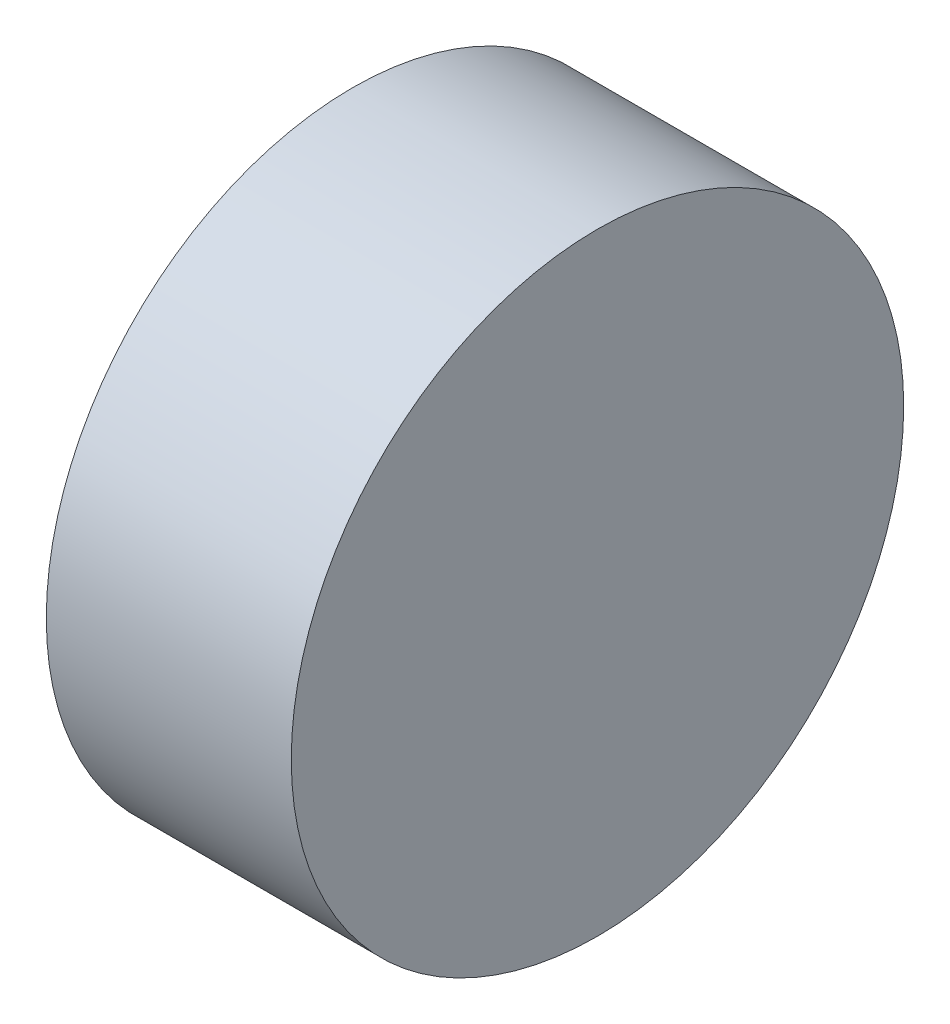
ISO-10303-21;
HEADER;
FILE_DESCRIPTION(('STEP AP214'),'2;1');
FILE_NAME('part.step','',(''),(''),'','','');
FILE_SCHEMA(('AUTOMOTIVE_DESIGN { 1 0 10303 214 1 1 1 1 }'));
ENDSEC;
DATA;
#1=APPLICATION_CONTEXT('core data for automotive mechanical design processes');
#2=APPLICATION_PROTOCOL_DEFINITION('international standard','automotive_design',2000,#1);
#3=PRODUCT_CONTEXT('',#1,'mechanical');
#4=PRODUCT('Part','Part','',(#3));
#5=PRODUCT_RELATED_PRODUCT_CATEGORY('part','',(#4));
#6=PRODUCT_DEFINITION_FORMATION('','',#4);
#7=PRODUCT_DEFINITION_CONTEXT('part definition',#1,'design');
#8=PRODUCT_DEFINITION('design','',#6,#7);
#9=PRODUCT_DEFINITION_SHAPE('','',#8);
#10=(LENGTH_UNIT() NAMED_UNIT(*) SI_UNIT(.MILLI.,.METRE.));
#11=(NAMED_UNIT(*) PLANE_ANGLE_UNIT() SI_UNIT($,.RADIAN.));
#12=(NAMED_UNIT(*) SI_UNIT($,.STERADIAN.) SOLID_ANGLE_UNIT());
#13=UNCERTAINTY_MEASURE_WITH_UNIT(LENGTH_MEASURE(1.E-05),#10,'distance_accuracy_value','');
#14=(GEOMETRIC_REPRESENTATION_CONTEXT(3) GLOBAL_UNCERTAINTY_ASSIGNED_CONTEXT((#13)) GLOBAL_UNIT_ASSIGNED_CONTEXT((#10,
#11,#12)) REPRESENTATION_CONTEXT('',''));
#15=CARTESIAN_POINT('',(0.,0.,0.));
#16=DIRECTION('',(0.,0.,1.));
#17=DIRECTION('',(1.,0.,0.));
#18=AXIS2_PLACEMENT_3D('',#15,#16,#17);
#19=CARTESIAN_POINT('',(4.,0.,0.));
#20=DIRECTION('',(-1.,0.,0.));
#21=DIRECTION('',(0.,0.,1.));
#22=AXIS2_PLACEMENT_3D('',#19,#20,#21);
#23=CYLINDRICAL_SURFACE('',#22,10.);
#24=CARTESIAN_POINT('',(4.,0.,0.));
#25=DIRECTION('',(1.,0.,0.));
#26=DIRECTION('',(0.,0.,-1.));
#27=AXIS2_PLACEMENT_3D('',#24,#25,#26);
#28=CIRCLE('',#27,10.);
#29=CARTESIAN_POINT('',(4.,0.,-10.));
#30=VERTEX_POINT('',#29);
#31=EDGE_CURVE('E11',#30,#30,#28,.T.);
#32=ORIENTED_EDGE('',*,*,#31,.F.);
#33=EDGE_LOOP('',(#32));
#34=FACE_BOUND('',#33,.T.);
#35=CARTESIAN_POINT('',(-4.,0.,0.));
#36=DIRECTION('',(1.,0.,0.));
#37=DIRECTION('',(0.,0.,-1.));
#38=AXIS2_PLACEMENT_3D('',#35,#36,#37);
#39=CIRCLE('',#38,10.);
#40=CARTESIAN_POINT('',(-4.,0.,-10.));
#41=VERTEX_POINT('',#40);
#42=EDGE_CURVE('E46',#41,#41,#39,.T.);
#43=ORIENTED_EDGE('',*,*,#42,.T.);
#44=EDGE_LOOP('',(#43));
#45=FACE_BOUND('',#44,.T.);
#46=ADVANCED_FACE('F43',(#34,#45),#23,.T.);
#47=CARTESIAN_POINT('',(4.,0.,0.));
#48=DIRECTION('',(1.,0.,0.));
#49=DIRECTION('',(0.,0.,-1.));
#50=AXIS2_PLACEMENT_3D('',#47,#48,#49);
#51=PLANE('',#50);
#52=ORIENTED_EDGE('',*,*,#31,.T.);
#53=EDGE_LOOP('',(#52));
#54=FACE_BOUND('',#53,.T.);
#55=ADVANCED_FACE('F107',(#54),#51,.T.);
#56=CARTESIAN_POINT('',(-4.,0.,0.));
#57=DIRECTION('',(1.,0.,0.));
#58=DIRECTION('',(0.,0.,-1.));
#59=AXIS2_PLACEMENT_3D('',#56,#57,#58);
#60=PLANE('',#59);
#61=CARTESIAN_POINT('',(-4.,0.,0.));
#62=DIRECTION('',(-1.,0.,0.));
#63=DIRECTION('',(0.,0.,1.));
#64=AXIS2_PLACEMENT_3D('',#61,#62,#63);
#65=CIRCLE('',#64,6.5);
#66=CARTESIAN_POINT('',(-4.,0.,6.5));
#67=VERTEX_POINT('',#66);
#68=EDGE_CURVE('E57',#67,#67,#65,.T.);
#69=ORIENTED_EDGE('',*,*,#68,.F.);
#70=EDGE_LOOP('',(#69));
#71=FACE_BOUND('',#70,.T.);
#72=ORIENTED_EDGE('',*,*,#42,.F.);
#73=EDGE_LOOP('',(#72));
#74=FACE_BOUND('',#73,.T.);
#75=ADVANCED_FACE('F93',(#71,#74),#60,.F.);
#76=CARTESIAN_POINT('',(2.,0.,0.));
#77=DIRECTION('',(-1.,0.,0.));
#78=DIRECTION('',(0.,0.,1.));
#79=AXIS2_PLACEMENT_3D('',#76,#77,#78);
#80=CYLINDRICAL_SURFACE('',#79,2.);
#81=CARTESIAN_POINT('',(2.,0.,0.));
#82=DIRECTION('',(-1.,0.,0.));
#83=DIRECTION('',(0.,0.,1.));
#84=AXIS2_PLACEMENT_3D('',#81,#82,#83);
#85=CIRCLE('',#84,2.);
#86=CARTESIAN_POINT('',(2.,0.,2.));
#87=VERTEX_POINT('',#86);
#88=EDGE_CURVE('E61',#87,#87,#85,.T.);
#89=ORIENTED_EDGE('',*,*,#88,.T.);
#90=EDGE_LOOP('',(#89));
#91=FACE_BOUND('',#90,.T.);
#92=CARTESIAN_POINT('',(-4.,0.,0.));
#93=DIRECTION('',(-1.,0.,0.));
#94=DIRECTION('',(0.,0.,1.));
#95=AXIS2_PLACEMENT_3D('',#92,#93,#94);
#96=CIRCLE('',#95,2.);
#97=CARTESIAN_POINT('',(-4.,0.,2.));
#98=VERTEX_POINT('',#97);
#99=EDGE_CURVE('E62',#98,#98,#96,.T.);
#100=ORIENTED_EDGE('',*,*,#99,.F.);
#101=EDGE_LOOP('',(#100));
#102=FACE_BOUND('',#101,.T.);
#103=ADVANCED_FACE('F96',(#91,#102),#80,.T.);
#104=CARTESIAN_POINT('',(2.,0.,0.));
#105=DIRECTION('',(-1.,0.,0.));
#106=DIRECTION('',(0.,0.,1.));
#107=AXIS2_PLACEMENT_3D('',#104,#105,#106);
#108=CYLINDRICAL_SURFACE('',#107,6.5);
#109=CARTESIAN_POINT('',(2.,0.,0.));
#110=DIRECTION('',(-1.,0.,0.));
#111=DIRECTION('',(0.,0.,1.));
#112=AXIS2_PLACEMENT_3D('',#109,#110,#111);
#113=CIRCLE('',#112,6.5);
#114=CARTESIAN_POINT('',(2.,0.,6.5));
#115=VERTEX_POINT('',#114);
#116=EDGE_CURVE('E55',#115,#115,#113,.T.);
#117=ORIENTED_EDGE('',*,*,#116,.F.);
#118=EDGE_LOOP('',(#117));
#119=FACE_BOUND('',#118,.T.);
#120=ORIENTED_EDGE('',*,*,#68,.T.);
#121=EDGE_LOOP('',(#120));
#122=FACE_BOUND('',#121,.T.);
#123=ADVANCED_FACE('F98',(#119,#122),#108,.F.);
#124=CARTESIAN_POINT('',(2.,0.,0.));
#125=DIRECTION('',(-1.,0.,0.));
#126=DIRECTION('',(0.,0.,1.));
#127=AXIS2_PLACEMENT_3D('',#124,#125,#126);
#128=PLANE('',#127);
#129=ORIENTED_EDGE('',*,*,#88,.F.);
#130=EDGE_LOOP('',(#129));
#131=FACE_BOUND('',#130,.T.);
#132=ORIENTED_EDGE('',*,*,#116,.T.);
#133=EDGE_LOOP('',(#132));
#134=FACE_BOUND('',#133,.T.);
#135=ADVANCED_FACE('F92',(#131,#134),#128,.T.);
#136=CARTESIAN_POINT('',(-4.,0.,0.));
#137=DIRECTION('',(-1.,0.,0.));
#138=DIRECTION('',(0.,0.,1.));
#139=AXIS2_PLACEMENT_3D('',#136,#137,#138);
#140=CIRCLE('',#139,1.);
#141=CARTESIAN_POINT('',(-4.,0.,1.));
#142=VERTEX_POINT('',#141);
#143=EDGE_CURVE('E73',#142,#142,#140,.T.);
#144=ORIENTED_EDGE('',*,*,#143,.F.);
#145=EDGE_LOOP('',(#144));
#146=FACE_BOUND('',#145,.T.);
#147=ORIENTED_EDGE('',*,*,#99,.T.);
#148=EDGE_LOOP('',(#147));
#149=FACE_BOUND('',#148,.T.);
#150=ADVANCED_FACE('F86',(#146,#149),#60,.F.);
#151=CARTESIAN_POINT('',(2.,0.,0.));
#152=DIRECTION('',(-1.,0.,0.));
#153=DIRECTION('',(0.,0.,1.));
#154=AXIS2_PLACEMENT_3D('',#151,#152,#153);
#155=CYLINDRICAL_SURFACE('',#154,1.);
#156=CARTESIAN_POINT('',(2.,0.,0.));
#157=DIRECTION('',(-1.,0.,0.));
#158=DIRECTION('',(0.,0.,1.));
#159=AXIS2_PLACEMENT_3D('',#156,#157,#158);
#160=CIRCLE('',#159,1.);
#161=CARTESIAN_POINT('',(2.,0.,1.));
#162=VERTEX_POINT('',#161);
#163=EDGE_CURVE('E66',#162,#162,#160,.T.);
#164=ORIENTED_EDGE('',*,*,#163,.F.);
#165=EDGE_LOOP('',(#164));
#166=FACE_BOUND('',#165,.T.);
#167=ORIENTED_EDGE('',*,*,#143,.T.);
#168=EDGE_LOOP('',(#167));
#169=FACE_BOUND('',#168,.T.);
#170=ADVANCED_FACE('F83',(#166,#169),#155,.F.);
#171=CARTESIAN_POINT('',(2.,0.,0.));
#172=DIRECTION('',(-1.,0.,0.));
#173=DIRECTION('',(0.,0.,1.));
#174=AXIS2_PLACEMENT_3D('',#171,#172,#173);
#175=PLANE('',#174);
#176=ORIENTED_EDGE('',*,*,#163,.T.);
#177=EDGE_LOOP('',(#176));
#178=FACE_BOUND('',#177,.T.);
#179=ADVANCED_FACE('F81',(#178),#175,.T.);
#180=CLOSED_SHELL('',(#46,#55,#75,#103,#123,#135,#150,#170,#179));
#181=MANIFOLD_SOLID_BREP('B2',#180);
#182=ADVANCED_BREP_SHAPE_REPRESENTATION('',(#18,#181),#14);
#183=SHAPE_DEFINITION_REPRESENTATION(#9,#182);
ENDSEC;
END-ISO-10303-21;
